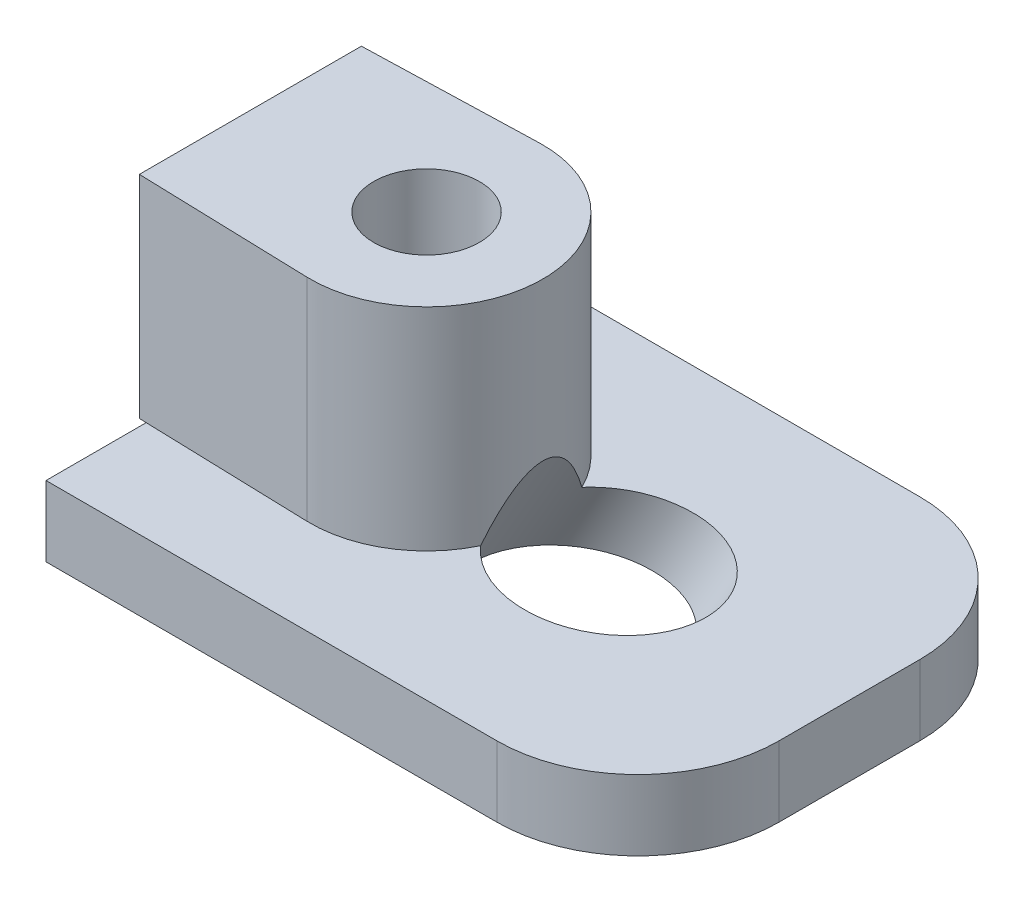
ISO-10303-21;
HEADER;
FILE_DESCRIPTION(('STEP AP214'),'2;1');
FILE_NAME('part.step','',(''),(''),'','','');
FILE_SCHEMA(('AUTOMOTIVE_DESIGN { 1 0 10303 214 1 1 1 1 }'));
ENDSEC;
DATA;
#1=APPLICATION_CONTEXT('core data for automotive mechanical design processes');
#2=APPLICATION_PROTOCOL_DEFINITION('international standard','automotive_design',2000,#1);
#3=PRODUCT_CONTEXT('',#1,'mechanical');
#4=PRODUCT('Part','Part','',(#3));
#5=PRODUCT_RELATED_PRODUCT_CATEGORY('part','',(#4));
#6=PRODUCT_DEFINITION_FORMATION('','',#4);
#7=PRODUCT_DEFINITION_CONTEXT('part definition',#1,'design');
#8=PRODUCT_DEFINITION('design','',#6,#7);
#9=PRODUCT_DEFINITION_SHAPE('','',#8);
#10=(LENGTH_UNIT() NAMED_UNIT(*) SI_UNIT(.MILLI.,.METRE.));
#11=(NAMED_UNIT(*) PLANE_ANGLE_UNIT() SI_UNIT($,.RADIAN.));
#12=(NAMED_UNIT(*) SI_UNIT($,.STERADIAN.) SOLID_ANGLE_UNIT());
#13=UNCERTAINTY_MEASURE_WITH_UNIT(LENGTH_MEASURE(1.E-05),#10,'distance_accuracy_value','');
#14=(GEOMETRIC_REPRESENTATION_CONTEXT(3) GLOBAL_UNCERTAINTY_ASSIGNED_CONTEXT((#13)) GLOBAL_UNIT_ASSIGNED_CONTEXT((#10,
#11,#12)) REPRESENTATION_CONTEXT('',''));
#15=CARTESIAN_POINT('',(0.,0.,0.));
#16=DIRECTION('',(0.,0.,1.));
#17=DIRECTION('',(1.,0.,0.));
#18=AXIS2_PLACEMENT_3D('',#15,#16,#17);
#19=CARTESIAN_POINT('',(2.5,7.75,0.));
#20=DIRECTION('',(0.,1.,0.));
#21=DIRECTION('',(0.,0.,1.));
#22=AXIS2_PLACEMENT_3D('',#19,#20,#21);
#23=PLANE('',#22);
#24=DIRECTION('',(0.,0.,-1.));
#25=VECTOR('',#24,1.);
#26=CARTESIAN_POINT('',(1.30000000001017,7.75,1.49999999996326));
#27=LINE('',#26,#25);
#28=CARTESIAN_POINT('',(1.30000000001017,7.75,0.789194940442877));
#29=VERTEX_POINT('',#28);
#30=CARTESIAN_POINT('',(1.30000000001017,7.75,-0.789194940442877));
#31=VERTEX_POINT('',#30);
#32=EDGE_CURVE('E48',#29,#31,#27,.T.);
#33=ORIENTED_EDGE('',*,*,#32,.F.);
#34=DIRECTION('',(0.99954579976556,0.,0.0301362600703334));
#35=VECTOR('',#34,1.);
#36=CARTESIAN_POINT('',(2.47513758544198,7.75,0.824625284806589));
#37=LINE('',#36,#35);
#38=CARTESIAN_POINT('',(1.25000000001017,7.75,0.787687442733547));
#39=VERTEX_POINT('',#38);
#40=EDGE_CURVE('E158',#39,#29,#37,.T.);
#41=ORIENTED_EDGE('',*,*,#40,.F.);
#42=DIRECTION('',(0.,0.,1.));
#43=VECTOR('',#42,1.);
#44=CARTESIAN_POINT('',(1.25000000001017,7.75,0.787687442733547));
#45=LINE('',#44,#43);
#46=CARTESIAN_POINT('',(1.25000000001017,7.75,-0.787687442733547));
#47=VERTEX_POINT('',#46);
#48=EDGE_CURVE('E155',#47,#39,#45,.T.);
#49=ORIENTED_EDGE('',*,*,#48,.F.);
#50=DIRECTION('',(-0.99954579976556,0.,0.0301362600703315));
#51=VECTOR('',#50,1.);
#52=CARTESIAN_POINT('',(1.25000000001017,7.75,-0.787687442733547));
#53=LINE('',#52,#51);
#54=EDGE_CURVE('E146',#31,#47,#53,.T.);
#55=ORIENTED_EDGE('',*,*,#54,.F.);
#56=EDGE_LOOP('',(#33,#41,#49,#55));
#57=FACE_BOUND('',#56,.T.);
#58=ADVANCED_FACE('F39',(#57),#23,.F.);
#59=CARTESIAN_POINT('',(2.5,9.25,0.));
#60=DIRECTION('',(0.,1.,0.));
#61=DIRECTION('',(0.,0.,1.));
#62=AXIS2_PLACEMENT_3D('',#59,#60,#61);
#63=PLANE('',#62);
#64=CARTESIAN_POINT('',(2.5,9.25,0.));
#65=DIRECTION('',(0.,1.,0.));
#66=DIRECTION('',(0.,0.,1.));
#67=AXIS2_PLACEMENT_3D('',#64,#65,#66);
#68=CIRCLE('',#67,0.825000000000001);
#69=CARTESIAN_POINT('',(2.47513758544198,9.25,0.824625284806589));
#70=VERTEX_POINT('',#69);
#71=CARTESIAN_POINT('',(2.47513758544198,9.25,-0.824625284806588));
#72=VERTEX_POINT('',#71);
#73=EDGE_CURVE('E160',#70,#72,#68,.T.);
#74=ORIENTED_EDGE('',*,*,#73,.T.);
#75=DIRECTION('',(-0.99954579976556,0.,0.0301362600703315));
#76=VECTOR('',#75,1.);
#77=CARTESIAN_POINT('',(1.25000000001017,9.25,-0.787687442733547));
#78=LINE('',#77,#76);
#79=CARTESIAN_POINT('',(1.25000000001017,9.25,-0.787687442733547));
#80=VERTEX_POINT('',#79);
#81=EDGE_CURVE('E295',#72,#80,#78,.T.);
#82=ORIENTED_EDGE('',*,*,#81,.T.);
#83=DIRECTION('',(0.,0.,1.));
#84=VECTOR('',#83,1.);
#85=CARTESIAN_POINT('',(1.25000000001017,9.25,0.787687442733547));
#86=LINE('',#85,#84);
#87=CARTESIAN_POINT('',(1.25000000001017,9.25,0.787687442733547));
#88=VERTEX_POINT('',#87);
#89=EDGE_CURVE('E296',#80,#88,#86,.T.);
#90=ORIENTED_EDGE('',*,*,#89,.T.);
#91=DIRECTION('',(0.99954579976556,0.,0.0301362600703334));
#92=VECTOR('',#91,1.);
#93=CARTESIAN_POINT('',(2.47513758544198,9.25,0.824625284806589));
#94=LINE('',#93,#92);
#95=EDGE_CURVE('E152',#88,#70,#94,.T.);
#96=ORIENTED_EDGE('',*,*,#95,.T.);
#97=EDGE_LOOP('',(#74,#82,#90,#96));
#98=FACE_BOUND('',#97,.T.);
#99=CARTESIAN_POINT('',(2.5,9.25,0.));
#100=DIRECTION('',(0.,1.,0.));
#101=DIRECTION('',(0.,0.,1.));
#102=AXIS2_PLACEMENT_3D('',#99,#100,#101);
#103=CIRCLE('',#102,0.374999999999997);
#104=CARTESIAN_POINT('',(2.5,9.25,0.374999999999998));
#105=VERTEX_POINT('',#104);
#106=EDGE_CURVE('E144',#105,#105,#103,.T.);
#107=ORIENTED_EDGE('',*,*,#106,.F.);
#108=EDGE_LOOP('',(#107));
#109=FACE_BOUND('',#108,.T.);
#110=ADVANCED_FACE('F246',(#98,#109),#63,.T.);
#111=CARTESIAN_POINT('',(2.5,9.25,0.));
#112=DIRECTION('',(0.,-1.,0.));
#113=DIRECTION('',(0.,0.,-1.));
#114=AXIS2_PLACEMENT_3D('',#111,#112,#113);
#115=CYLINDRICAL_SURFACE('',#114,0.825000000000001);
#116=CARTESIAN_POINT('',(2.5,7.75,0.));
#117=DIRECTION('',(0.,1.,0.));
#118=DIRECTION('',(0.,0.,1.));
#119=AXIS2_PLACEMENT_3D('',#116,#117,#118);
#120=CIRCLE('',#119,0.825000000000001);
#121=CARTESIAN_POINT('',(2.47513758544198,7.75,0.824625284806589));
#122=VERTEX_POINT('',#121);
#123=CARTESIAN_POINT('',(3.2427713292277,7.75,0.359048398516585));
#124=VERTEX_POINT('',#123);
#125=EDGE_CURVE('E137',#122,#124,#120,.T.);
#126=ORIENTED_EDGE('',*,*,#125,.T.);
#127=CARTESIAN_POINT('',(3.2427713292277,7.75,0.359048398516585));
#128=CARTESIAN_POINT('',(3.24734672347552,7.77217971307887,0.349565049921853));
#129=CARTESIAN_POINT('',(3.25192600277813,7.79418896030448,0.33964566753348));
#130=CARTESIAN_POINT('',(3.26106805188744,7.83780146526785,0.318646845721492));
#131=CARTESIAN_POINT('',(3.26563059435548,7.85940184355562,0.307561357337247));
#132=CARTESIAN_POINT('',(3.27483349496606,7.90268314619792,0.28359900724088));
#133=CARTESIAN_POINT('',(3.27947033327997,7.92433658834901,0.270670478878927));
#134=CARTESIAN_POINT('',(3.28854048447935,7.96644084771411,0.242985116613794));
#135=CARTESIAN_POINT('',(3.29297426897767,7.98689448628587,0.228232848119379));
#136=CARTESIAN_POINT('',(3.30055565002327,8.02169384050402,0.199757082741822));
#137=CARTESIAN_POINT('',(3.30377388010276,8.03640319300004,0.186502368601944));
#138=CARTESIAN_POINT('',(3.3098203207619,8.06394792303974,0.158191350371955));
#139=CARTESIAN_POINT('',(3.31265093437802,8.07679487870224,0.143147338628181));
#140=CARTESIAN_POINT('',(3.31676217281508,8.09540823105043,0.116754702154036));
#141=CARTESIAN_POINT('',(3.31823160844037,8.10204826763883,0.106059049926062));
#142=CARTESIAN_POINT('',(3.32081305778399,8.11369928252237,0.0837634575396931));
#143=CARTESIAN_POINT('',(3.32192551622894,8.1187122878832,0.0721646650986338));
#144=CARTESIAN_POINT('',(3.32352855059013,8.12593093021106,0.050249048831502));
#145=CARTESIAN_POINT('',(3.32409262549927,8.12846862260195,0.0400487219740886));
#146=CARTESIAN_POINT('',(3.32483773061379,8.13182010354673,0.0193539820251326));
#147=CARTESIAN_POINT('',(3.32501905805271,8.13263522980936,0.00885980355493707));
#148=CARTESIAN_POINT('',(3.32497771259252,8.13244932465132,-0.0121243160797312));
#149=CARTESIAN_POINT('',(3.32475453893937,8.1314460421229,-0.0226142358903848));
#150=CARTESIAN_POINT('',(3.32392954484907,8.12773491274186,-0.0432704549303667));
#151=CARTESIAN_POINT('',(3.32332742774229,8.12502573036279,-0.0534364940404541));
#152=CARTESIAN_POINT('',(3.3215517727802,8.11702845306051,-0.0764987713816014));
#153=CARTESIAN_POINT('',(3.32025530931587,8.11118467727236,-0.0891905515857784));
#154=CARTESIAN_POINT('',(3.31725174901187,8.09762121101009,-0.1134683712181));
#155=CARTESIAN_POINT('',(3.3155437219126,8.0898972703788,-0.12505182140944));
#156=CARTESIAN_POINT('',(3.31047880905792,8.0669416220475,-0.155342848088699));
#157=CARTESIAN_POINT('',(3.30683682327192,8.05038263487886,-0.172982147986076));
#158=CARTESIAN_POINT('',(3.29909159161891,8.0149946757332,-0.205823776531038));
#159=CARTESIAN_POINT('',(3.29498527036661,7.99615050094222,-0.221008018210512));
#160=CARTESIAN_POINT('',(3.28691564265625,7.9589102788101,-0.248131167074746));
#161=CARTESIAN_POINT('',(3.2829737224174,7.94063145414876,-0.260239966936255));
#162=CARTESIAN_POINT('',(3.27496842011141,7.90329940773891,-0.283190139279665));
#163=CARTESIAN_POINT('',(3.27090489842919,7.88424528605347,-0.294029978767528));
#164=CARTESIAN_POINT('',(3.26283619408453,7.84617097550688,-0.314359991022478));
#165=CARTESIAN_POINT('',(3.25883284513023,7.82716647818218,-0.323880617454054));
#166=CARTESIAN_POINT('',(3.25080948153018,7.78881967149931,-0.342062365870405));
#167=CARTESIAN_POINT('',(3.2467895441114,7.7694784476414,-0.350725802804259));
#168=CARTESIAN_POINT('',(3.2427713292277,7.75,-0.35904839851659));
#169=B_SPLINE_CURVE_WITH_KNOTS('',3,(#127,#128,#129,#130,#131,#132,#133,#134,#135,#136,#137,
#138,#139,#140,#141,#142,#143,#144,#145,#146,#147,#148,#149,#150,#151,#152,#153,#154,#155,#156,
#157,#158,#159,#160,#161,#162,#163,#164,#165,#166,#167,#168),.UNSPECIFIED.,.F.,.F.,(4,2,2,2,2,2,
2,2,2,2,2,2,2,2,2,2,2,2,2,2,4),(0.,0.0736749599645764,0.147752939160669,0.224614953753801,
0.301288312807912,0.361361320483473,0.421043184119437,0.458961245695404,0.49683188340662,
0.528275531905357,0.559694752939033,0.59115289611565,0.622635698129949,0.664494694214626,
0.70644920690254,0.779437629745386,0.852941425440353,0.919708409452639,0.986555238036391,
1.05142330953229,1.11611111969407),.UNSPECIFIED.);
#170=CARTESIAN_POINT('',(3.2427713292277,7.75,-0.359048398516584));
#171=VERTEX_POINT('',#170);
#172=EDGE_CURVE('E53',#124,#171,#169,.T.);
#173=ORIENTED_EDGE('',*,*,#172,.T.);
#174=CARTESIAN_POINT('',(2.47513758544198,7.75,-0.824625284806588));
#175=VERTEX_POINT('',#174);
#176=EDGE_CURVE('E134',#171,#175,#120,.T.);
#177=ORIENTED_EDGE('',*,*,#176,.T.);
#178=DIRECTION('',(0.,-1.,0.));
#179=VECTOR('',#178,1.);
#180=CARTESIAN_POINT('',(2.47513758544198,9.25,-0.824625284806588));
#181=LINE('',#180,#179);
#182=EDGE_CURVE('E168',#72,#175,#181,.T.);
#183=ORIENTED_EDGE('',*,*,#182,.F.);
#184=ORIENTED_EDGE('',*,*,#73,.F.);
#185=DIRECTION('',(0.,-1.,0.));
#186=VECTOR('',#185,1.);
#187=CARTESIAN_POINT('',(2.47513758544198,9.25,0.824625284806589));
#188=LINE('',#187,#186);
#189=EDGE_CURVE('E161',#70,#122,#188,.T.);
#190=ORIENTED_EDGE('',*,*,#189,.T.);
#191=EDGE_LOOP('',(#126,#173,#177,#183,#184,#190));
#192=FACE_BOUND('',#191,.T.);
#193=ADVANCED_FACE('F41',(#192),#115,.T.);
#194=CARTESIAN_POINT('',(1.25000000001017,9.25,-0.787687442733547));
#195=DIRECTION('',(0.0301362600703315,0.,0.99954579976556));
#196=DIRECTION('',(0.99954579976556,0.,-0.0301362600703315));
#197=AXIS2_PLACEMENT_3D('',#194,#195,#196);
#198=PLANE('',#197);
#199=EDGE_CURVE('E143',#175,#31,#53,.T.);
#200=ORIENTED_EDGE('',*,*,#199,.T.);
#201=ORIENTED_EDGE('',*,*,#54,.T.);
#202=DIRECTION('',(0.,-1.,0.));
#203=VECTOR('',#202,1.);
#204=CARTESIAN_POINT('',(1.25000000001017,9.25,-0.787687442733547));
#205=LINE('',#204,#203);
#206=EDGE_CURVE('E166',#80,#47,#205,.T.);
#207=ORIENTED_EDGE('',*,*,#206,.F.);
#208=ORIENTED_EDGE('',*,*,#81,.F.);
#209=ORIENTED_EDGE('',*,*,#182,.T.);
#210=EDGE_LOOP('',(#200,#201,#207,#208,#209));
#211=FACE_BOUND('',#210,.T.);
#212=ADVANCED_FACE('F257',(#211),#198,.F.);
#213=CARTESIAN_POINT('',(1.25000000001017,9.25,0.787687442733547));
#214=DIRECTION('',(1.,0.,0.));
#215=DIRECTION('',(0.,0.,-1.));
#216=AXIS2_PLACEMENT_3D('',#213,#214,#215);
#217=PLANE('',#216);
#218=ORIENTED_EDGE('',*,*,#48,.T.);
#219=DIRECTION('',(0.,-1.,0.));
#220=VECTOR('',#219,1.);
#221=CARTESIAN_POINT('',(1.25000000001017,9.25,0.787687442733547));
#222=LINE('',#221,#220);
#223=EDGE_CURVE('E163',#88,#39,#222,.T.);
#224=ORIENTED_EDGE('',*,*,#223,.F.);
#225=ORIENTED_EDGE('',*,*,#89,.F.);
#226=ORIENTED_EDGE('',*,*,#206,.T.);
#227=EDGE_LOOP('',(#218,#224,#225,#226));
#228=FACE_BOUND('',#227,.T.);
#229=ADVANCED_FACE('F254',(#228),#217,.F.);
#230=CARTESIAN_POINT('',(2.47513758544198,9.25,0.824625284806589));
#231=DIRECTION('',(0.0301362600703333,0.,-0.99954579976556));
#232=DIRECTION('',(-0.99954579976556,0.,-0.0301362600703334));
#233=AXIS2_PLACEMENT_3D('',#230,#231,#232);
#234=PLANE('',#233);
#235=ORIENTED_EDGE('',*,*,#40,.T.);
#236=EDGE_CURVE('E157',#29,#122,#37,.T.);
#237=ORIENTED_EDGE('',*,*,#236,.T.);
#238=ORIENTED_EDGE('',*,*,#189,.F.);
#239=ORIENTED_EDGE('',*,*,#95,.F.);
#240=ORIENTED_EDGE('',*,*,#223,.T.);
#241=EDGE_LOOP('',(#235,#237,#238,#239,#240));
#242=FACE_BOUND('',#241,.T.);
#243=ADVANCED_FACE('F244',(#242),#234,.F.);
#244=CARTESIAN_POINT('',(2.5,9.25,0.));
#245=DIRECTION('',(0.,-1.,0.));
#246=DIRECTION('',(0.,0.,-1.));
#247=AXIS2_PLACEMENT_3D('',#244,#245,#246);
#248=CYLINDRICAL_SURFACE('',#247,0.374999999999997);
#249=ORIENTED_EDGE('',*,*,#106,.T.);
#250=EDGE_LOOP('',(#249));
#251=FACE_BOUND('',#250,.T.);
#252=CARTESIAN_POINT('',(2.5,7.75,0.));
#253=DIRECTION('',(0.,1.,0.));
#254=DIRECTION('',(0.,0.,1.));
#255=AXIS2_PLACEMENT_3D('',#252,#253,#254);
#256=CIRCLE('',#255,0.374999999999997);
#257=CARTESIAN_POINT('',(2.5,7.75,0.374999999999998));
#258=VERTEX_POINT('',#257);
#259=EDGE_CURVE('E148',#258,#258,#256,.T.);
#260=ORIENTED_EDGE('',*,*,#259,.F.);
#261=EDGE_LOOP('',(#260));
#262=FACE_BOUND('',#261,.T.);
#263=ADVANCED_FACE('F216',(#251,#262),#248,.F.);
#264=CARTESIAN_POINT('',(4.50000000001019,7.25,0.499999999963261));
#265=DIRECTION('',(0.,1.,0.));
#266=DIRECTION('',(-1.,0.,0.));
#267=AXIS2_PLACEMENT_3D('',#264,#265,#266);
#268=PLANE('',#267);
#269=CARTESIAN_POINT('',(3.50470053838943,7.25,0.));
#270=DIRECTION('',(0.,1.,0.));
#271=DIRECTION('',(1.,0.,0.));
#272=AXIS2_PLACEMENT_3D('',#269,#270,#271);
#273=ELLIPSE('',#272,0.689240751358572,0.5969);
#274=CARTESIAN_POINT('',(4.193941289748,7.25,0.));
#275=VERTEX_POINT('',#274);
#276=EDGE_CURVE('E138',#275,#275,#273,.T.);
#277=ORIENTED_EDGE('',*,*,#276,.T.);
#278=EDGE_LOOP('',(#277));
#279=FACE_BOUND('',#278,.T.);
#280=DIRECTION('',(-1.,0.,0.));
#281=VECTOR('',#280,1.);
#282=CARTESIAN_POINT('',(1.30000000001017,7.25,1.49999999996326));
#283=LINE('',#282,#281);
#284=CARTESIAN_POINT('',(4.50000000001019,7.25,1.49999999996326));
#285=VERTEX_POINT('',#284);
#286=CARTESIAN_POINT('',(1.30000000001017,7.25,1.49999999996326));
#287=VERTEX_POINT('',#286);
#288=EDGE_CURVE('E200',#285,#287,#283,.T.);
#289=ORIENTED_EDGE('',*,*,#288,.T.);
#290=DIRECTION('',(0.,0.,-1.));
#291=VECTOR('',#290,1.);
#292=CARTESIAN_POINT('',(1.30000000001017,7.25,1.49999999996326));
#293=LINE('',#292,#291);
#294=CARTESIAN_POINT('',(1.30000000001017,7.25,-1.50000000003674));
#295=VERTEX_POINT('',#294);
#296=EDGE_CURVE('E198',#287,#295,#293,.T.);
#297=ORIENTED_EDGE('',*,*,#296,.T.);
#298=DIRECTION('',(1.,0.,0.));
#299=VECTOR('',#298,1.);
#300=CARTESIAN_POINT('',(4.50000000001019,7.25,-1.50000000003674));
#301=LINE('',#300,#299);
#302=CARTESIAN_POINT('',(4.50000000001019,7.25,-1.50000000003674));
#303=VERTEX_POINT('',#302);
#304=EDGE_CURVE('E196',#295,#303,#301,.T.);
#305=ORIENTED_EDGE('',*,*,#304,.T.);
#306=CARTESIAN_POINT('',(4.50000000001019,7.25,-0.500000000036739));
#307=DIRECTION('',(0.,-1.,0.));
#308=DIRECTION('',(-1.,0.,0.));
#309=AXIS2_PLACEMENT_3D('',#306,#307,#308);
#310=CIRCLE('',#309,1.);
#311=CARTESIAN_POINT('',(5.50000000001019,7.25,-0.500000000036739));
#312=VERTEX_POINT('',#311);
#313=EDGE_CURVE('E194',#303,#312,#310,.T.);
#314=ORIENTED_EDGE('',*,*,#313,.T.);
#315=DIRECTION('',(0.,0.,1.));
#316=VECTOR('',#315,1.);
#317=CARTESIAN_POINT('',(5.50000000001019,7.25,0.499999999963261));
#318=LINE('',#317,#316);
#319=CARTESIAN_POINT('',(5.50000000001019,7.25,0.499999999963261));
#320=VERTEX_POINT('',#319);
#321=EDGE_CURVE('E192',#312,#320,#318,.T.);
#322=ORIENTED_EDGE('',*,*,#321,.T.);
#323=CARTESIAN_POINT('',(4.50000000001019,7.25,0.499999999963261));
#324=DIRECTION('',(0.,-1.,0.));
#325=DIRECTION('',(-1.,0.,0.));
#326=AXIS2_PLACEMENT_3D('',#323,#324,#325);
#327=CIRCLE('',#326,1.);
#328=EDGE_CURVE('E189',#320,#285,#327,.T.);
#329=ORIENTED_EDGE('',*,*,#328,.T.);
#330=EDGE_LOOP('',(#289,#297,#305,#314,#322,#329));
#331=FACE_BOUND('',#330,.T.);
#332=ADVANCED_FACE('F212',(#279,#331),#268,.F.);
#333=CARTESIAN_POINT('',(4.50000000001019,7.25,0.499999999963261));
#334=DIRECTION('',(0.,1.,0.));
#335=DIRECTION('',(-1.,0.,0.));
#336=AXIS2_PLACEMENT_3D('',#333,#334,#335);
#337=CYLINDRICAL_SURFACE('',#336,1.);
#338=CARTESIAN_POINT('',(4.50000000001019,7.75,0.499999999963261));
#339=DIRECTION('',(0.,-1.,0.));
#340=DIRECTION('',(-1.,0.,0.));
#341=AXIS2_PLACEMENT_3D('',#338,#339,#340);
#342=CIRCLE('',#341,1.);
#343=CARTESIAN_POINT('',(5.50000000001019,7.75,0.499999999963261));
#344=VERTEX_POINT('',#343);
#345=CARTESIAN_POINT('',(4.50000000001019,7.75,1.49999999996326));
#346=VERTEX_POINT('',#345);
#347=EDGE_CURVE('E202',#344,#346,#342,.T.);
#348=ORIENTED_EDGE('',*,*,#347,.T.);
#349=DIRECTION('',(0.,1.,0.));
#350=VECTOR('',#349,1.);
#351=CARTESIAN_POINT('',(4.50000000001019,7.25,1.49999999996326));
#352=LINE('',#351,#350);
#353=EDGE_CURVE('E191',#285,#346,#352,.T.);
#354=ORIENTED_EDGE('',*,*,#353,.F.);
#355=ORIENTED_EDGE('',*,*,#328,.F.);
#356=DIRECTION('',(0.,1.,0.));
#357=VECTOR('',#356,1.);
#358=CARTESIAN_POINT('',(5.50000000001019,7.25,0.499999999963261));
#359=LINE('',#358,#357);
#360=EDGE_CURVE('E278',#320,#344,#359,.T.);
#361=ORIENTED_EDGE('',*,*,#360,.T.);
#362=EDGE_LOOP('',(#348,#354,#355,#361));
#363=FACE_BOUND('',#362,.T.);
#364=ADVANCED_FACE('F215',(#363),#337,.T.);
#365=CARTESIAN_POINT('',(5.50000000001019,7.25,0.499999999963261));
#366=DIRECTION('',(-1.,0.,0.));
#367=DIRECTION('',(0.,-1.,0.));
#368=AXIS2_PLACEMENT_3D('',#365,#366,#367);
#369=PLANE('',#368);
#370=DIRECTION('',(0.,0.,1.));
#371=VECTOR('',#370,1.);
#372=CARTESIAN_POINT('',(5.50000000001019,7.75,0.499999999963261));
#373=LINE('',#372,#371);
#374=CARTESIAN_POINT('',(5.50000000001019,7.75,-0.500000000036739));
#375=VERTEX_POINT('',#374);
#376=EDGE_CURVE('E272',#375,#344,#373,.T.);
#377=ORIENTED_EDGE('',*,*,#376,.T.);
#378=ORIENTED_EDGE('',*,*,#360,.F.);
#379=ORIENTED_EDGE('',*,*,#321,.F.);
#380=DIRECTION('',(0.,1.,0.));
#381=VECTOR('',#380,1.);
#382=CARTESIAN_POINT('',(5.50000000001019,7.25,-0.500000000036739));
#383=LINE('',#382,#381);
#384=EDGE_CURVE('E281',#312,#375,#383,.T.);
#385=ORIENTED_EDGE('',*,*,#384,.T.);
#386=EDGE_LOOP('',(#377,#378,#379,#385));
#387=FACE_BOUND('',#386,.T.);
#388=ADVANCED_FACE('F223',(#387),#369,.F.);
#389=CARTESIAN_POINT('',(4.50000000001019,7.25,-0.500000000036739));
#390=DIRECTION('',(0.,1.,0.));
#391=DIRECTION('',(-1.,0.,0.));
#392=AXIS2_PLACEMENT_3D('',#389,#390,#391);
#393=CYLINDRICAL_SURFACE('',#392,1.);
#394=CARTESIAN_POINT('',(4.50000000001019,7.75,-0.500000000036739));
#395=DIRECTION('',(0.,-1.,0.));
#396=DIRECTION('',(-1.,0.,0.));
#397=AXIS2_PLACEMENT_3D('',#394,#395,#396);
#398=CIRCLE('',#397,1.);
#399=CARTESIAN_POINT('',(4.50000000001019,7.75,-1.50000000003674));
#400=VERTEX_POINT('',#399);
#401=EDGE_CURVE('E269',#400,#375,#398,.T.);
#402=ORIENTED_EDGE('',*,*,#401,.T.);
#403=ORIENTED_EDGE('',*,*,#384,.F.);
#404=ORIENTED_EDGE('',*,*,#313,.F.);
#405=DIRECTION('',(0.,1.,0.));
#406=VECTOR('',#405,1.);
#407=CARTESIAN_POINT('',(4.50000000001019,7.25,-1.50000000003674));
#408=LINE('',#407,#406);
#409=EDGE_CURVE('E284',#303,#400,#408,.T.);
#410=ORIENTED_EDGE('',*,*,#409,.T.);
#411=EDGE_LOOP('',(#402,#403,#404,#410));
#412=FACE_BOUND('',#411,.T.);
#413=ADVANCED_FACE('F227',(#412),#393,.T.);
#414=CARTESIAN_POINT('',(4.50000000001019,7.25,-1.50000000003674));
#415=DIRECTION('',(0.,0.,1.));
#416=DIRECTION('',(1.,0.,0.));
#417=AXIS2_PLACEMENT_3D('',#414,#415,#416);
#418=PLANE('',#417);
#419=DIRECTION('',(1.,0.,0.));
#420=VECTOR('',#419,1.);
#421=CARTESIAN_POINT('',(4.50000000001019,7.75,-1.50000000003674));
#422=LINE('',#421,#420);
#423=CARTESIAN_POINT('',(1.30000000001017,7.75,-1.50000000003674));
#424=VERTEX_POINT('',#423);
#425=EDGE_CURVE('E177',#424,#400,#422,.T.);
#426=ORIENTED_EDGE('',*,*,#425,.T.);
#427=ORIENTED_EDGE('',*,*,#409,.F.);
#428=ORIENTED_EDGE('',*,*,#304,.F.);
#429=DIRECTION('',(0.,1.,0.));
#430=VECTOR('',#429,1.);
#431=CARTESIAN_POINT('',(1.30000000001017,7.25,-1.50000000003674));
#432=LINE('',#431,#430);
#433=EDGE_CURVE('E286',#295,#424,#432,.T.);
#434=ORIENTED_EDGE('',*,*,#433,.T.);
#435=EDGE_LOOP('',(#426,#427,#428,#434));
#436=FACE_BOUND('',#435,.T.);
#437=ADVANCED_FACE('F231',(#436),#418,.F.);
#438=CARTESIAN_POINT('',(1.30000000001017,7.25,1.49999999996326));
#439=DIRECTION('',(1.,0.,0.));
#440=DIRECTION('',(0.,0.,-1.));
#441=AXIS2_PLACEMENT_3D('',#438,#439,#440);
#442=PLANE('',#441);
#443=CARTESIAN_POINT('',(1.30000000001017,7.75,1.49999999996326));
#444=VERTEX_POINT('',#443);
#445=EDGE_CURVE('E171',#444,#29,#27,.T.);
#446=ORIENTED_EDGE('',*,*,#445,.T.);
#447=ORIENTED_EDGE('',*,*,#32,.T.);
#448=EDGE_CURVE('E172',#31,#424,#27,.T.);
#449=ORIENTED_EDGE('',*,*,#448,.T.);
#450=ORIENTED_EDGE('',*,*,#433,.F.);
#451=ORIENTED_EDGE('',*,*,#296,.F.);
#452=DIRECTION('',(0.,1.,0.));
#453=VECTOR('',#452,1.);
#454=CARTESIAN_POINT('',(1.30000000001017,7.25,1.49999999996326));
#455=LINE('',#454,#453);
#456=EDGE_CURVE('E288',#287,#444,#455,.T.);
#457=ORIENTED_EDGE('',*,*,#456,.T.);
#458=EDGE_LOOP('',(#446,#447,#449,#450,#451,#457));
#459=FACE_BOUND('',#458,.T.);
#460=ADVANCED_FACE('F235',(#459),#442,.F.);
#461=CARTESIAN_POINT('',(1.30000000001017,7.25,1.49999999996326));
#462=DIRECTION('',(0.,0.,-1.));
#463=DIRECTION('',(0.,1.,0.));
#464=AXIS2_PLACEMENT_3D('',#461,#462,#463);
#465=PLANE('',#464);
#466=DIRECTION('',(-1.,0.,0.));
#467=VECTOR('',#466,1.);
#468=CARTESIAN_POINT('',(1.30000000001017,7.75,1.49999999996326));
#469=LINE('',#468,#467);
#470=EDGE_CURVE('E178',#346,#444,#469,.T.);
#471=ORIENTED_EDGE('',*,*,#470,.T.);
#472=ORIENTED_EDGE('',*,*,#456,.F.);
#473=ORIENTED_EDGE('',*,*,#288,.F.);
#474=ORIENTED_EDGE('',*,*,#353,.T.);
#475=EDGE_LOOP('',(#471,#472,#473,#474));
#476=FACE_BOUND('',#475,.T.);
#477=ADVANCED_FACE('F239',(#476),#465,.F.);
#478=CARTESIAN_POINT('',(4.50000000001019,7.75,0.499999999963261));
#479=DIRECTION('',(0.,1.,0.));
#480=DIRECTION('',(-1.,0.,0.));
#481=AXIS2_PLACEMENT_3D('',#478,#479,#480);
#482=PLANE('',#481);
#483=CARTESIAN_POINT('',(3.79337567298423,7.75,0.));
#484=DIRECTION('',(0.,1.,0.));
#485=DIRECTION('',(1.,0.,0.));
#486=AXIS2_PLACEMENT_3D('',#483,#484,#485);
#487=ELLIPSE('',#486,0.689240751358572,0.5969);
#488=EDGE_CURVE('E11',#124,#171,#487,.T.);
#489=ORIENTED_EDGE('',*,*,#488,.F.);
#490=ORIENTED_EDGE('',*,*,#125,.F.);
#491=ORIENTED_EDGE('',*,*,#236,.F.);
#492=ORIENTED_EDGE('',*,*,#445,.F.);
#493=ORIENTED_EDGE('',*,*,#470,.F.);
#494=ORIENTED_EDGE('',*,*,#347,.F.);
#495=ORIENTED_EDGE('',*,*,#376,.F.);
#496=ORIENTED_EDGE('',*,*,#401,.F.);
#497=ORIENTED_EDGE('',*,*,#425,.F.);
#498=ORIENTED_EDGE('',*,*,#448,.F.);
#499=ORIENTED_EDGE('',*,*,#199,.F.);
#500=ORIENTED_EDGE('',*,*,#176,.F.);
#501=EDGE_LOOP('',(#489,#490,#491,#492,#493,#494,#495,#496,#497,#498,#499,#500));
#502=FACE_BOUND('',#501,.T.);
#503=ADVANCED_FACE('F141',(#502),#482,.T.);
#504=ORIENTED_EDGE('',*,*,#259,.T.);
#505=EDGE_LOOP('',(#504));
#506=FACE_BOUND('',#505,.T.);
#507=ADVANCED_FACE('F211',(#506),#482,.T.);
#508=CARTESIAN_POINT('',(0.0644065234306004,1.29123597311608,0.));
#509=DIRECTION('',(0.499999999999993,0.866025403784443,0.));
#510=DIRECTION('',(-0.866025403784443,0.499999999999993,0.));
#511=AXIS2_PLACEMENT_3D('',#508,#509,#510);
#512=CYLINDRICAL_SURFACE('',#511,0.5969);
#513=ORIENTED_EDGE('',*,*,#488,.T.);
#514=ORIENTED_EDGE('',*,*,#172,.F.);
#515=EDGE_LOOP('',(#513,#514));
#516=FACE_BOUND('',#515,.T.);
#517=ORIENTED_EDGE('',*,*,#276,.F.);
#518=EDGE_LOOP('',(#517));
#519=FACE_BOUND('',#518,.T.);
#520=ADVANCED_FACE('F126',(#516,#519),#512,.F.);
#521=CLOSED_SHELL('',(#58,#110,#193,#212,#229,#243,#263,#332,#364,#388,#413,#437,#460,#477,#503,
#507,#520));
#522=MANIFOLD_SOLID_BREP('B2',#521);
#523=ADVANCED_BREP_SHAPE_REPRESENTATION('',(#18,#522),#14);
#524=SHAPE_DEFINITION_REPRESENTATION(#9,#523);
ENDSEC;
END-ISO-10303-21;
